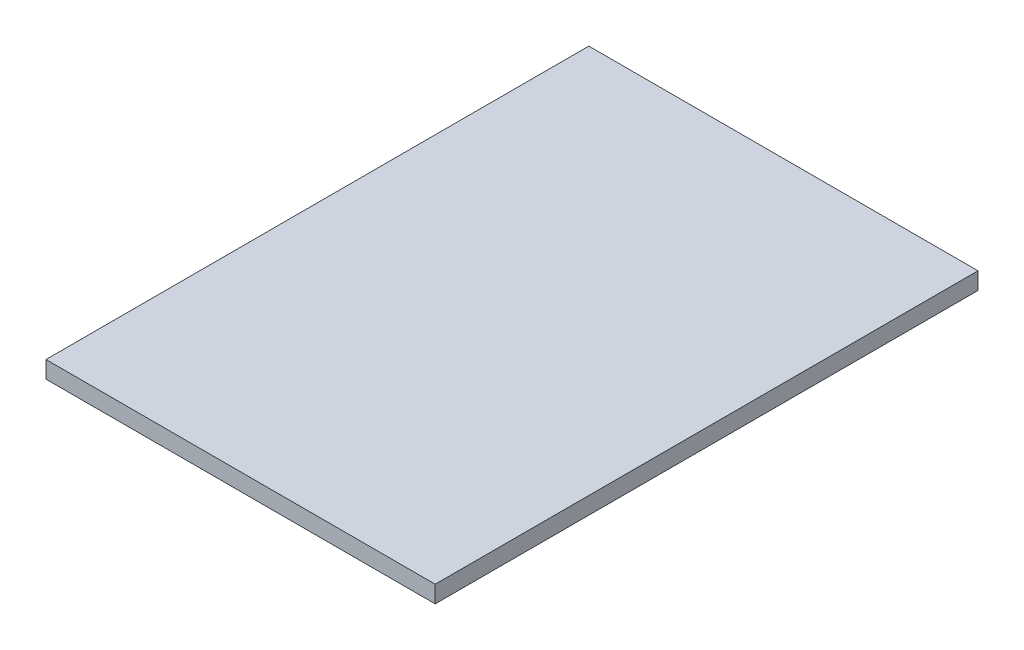
ISO-10303-21;
HEADER;
FILE_DESCRIPTION(('STEP AP214'),'2;1');
FILE_NAME('part.step','',(''),(''),'','','');
FILE_SCHEMA(('AUTOMOTIVE_DESIGN { 1 0 10303 214 1 1 1 1 }'));
ENDSEC;
DATA;
#1=APPLICATION_CONTEXT('core data for automotive mechanical design processes');
#2=APPLICATION_PROTOCOL_DEFINITION('international standard','automotive_design',2000,#1);
#3=PRODUCT_CONTEXT('',#1,'mechanical');
#4=PRODUCT('Part','Part','',(#3));
#5=PRODUCT_RELATED_PRODUCT_CATEGORY('part','',(#4));
#6=PRODUCT_DEFINITION_FORMATION('','',#4);
#7=PRODUCT_DEFINITION_CONTEXT('part definition',#1,'design');
#8=PRODUCT_DEFINITION('design','',#6,#7);
#9=PRODUCT_DEFINITION_SHAPE('','',#8);
#10=(LENGTH_UNIT() NAMED_UNIT(*) SI_UNIT(.MILLI.,.METRE.));
#11=(NAMED_UNIT(*) PLANE_ANGLE_UNIT() SI_UNIT($,.RADIAN.));
#12=(NAMED_UNIT(*) SI_UNIT($,.STERADIAN.) SOLID_ANGLE_UNIT());
#13=UNCERTAINTY_MEASURE_WITH_UNIT(LENGTH_MEASURE(1.E-05),#10,'distance_accuracy_value','');
#14=(GEOMETRIC_REPRESENTATION_CONTEXT(3) GLOBAL_UNCERTAINTY_ASSIGNED_CONTEXT((#13)) GLOBAL_UNIT_ASSIGNED_CONTEXT((#10,
#11,#12)) REPRESENTATION_CONTEXT('',''));
#15=CARTESIAN_POINT('',(0.,0.,0.));
#16=DIRECTION('',(0.,0.,1.));
#17=DIRECTION('',(1.,0.,0.));
#18=AXIS2_PLACEMENT_3D('',#15,#16,#17);
#19=CARTESIAN_POINT('',(28.956,2.54,40.386));
#20=DIRECTION('',(-1.,0.,0.));
#21=DIRECTION('',(0.,0.,1.));
#22=AXIS2_PLACEMENT_3D('',#19,#20,#21);
#23=PLANE('',#22);
#24=DIRECTION('',(0.,0.,-1.));
#25=VECTOR('',#24,1.);
#26=CARTESIAN_POINT('',(28.956,0.,40.386));
#27=LINE('',#26,#25);
#28=CARTESIAN_POINT('',(28.956,0.,40.386));
#29=VERTEX_POINT('',#28);
#30=CARTESIAN_POINT('',(28.956,0.,-40.386));
#31=VERTEX_POINT('',#30);
#32=EDGE_CURVE('E102',#29,#31,#27,.T.);
#33=ORIENTED_EDGE('',*,*,#32,.T.);
#34=DIRECTION('',(0.,-1.,0.));
#35=VECTOR('',#34,1.);
#36=CARTESIAN_POINT('',(28.956,2.54,-40.386));
#37=LINE('',#36,#35);
#38=CARTESIAN_POINT('',(28.956,2.54,-40.386));
#39=VERTEX_POINT('',#38);
#40=EDGE_CURVE('E11',#39,#31,#37,.T.);
#41=ORIENTED_EDGE('',*,*,#40,.F.);
#42=DIRECTION('',(0.,0.,-1.));
#43=VECTOR('',#42,1.);
#44=CARTESIAN_POINT('',(28.956,2.54,40.386));
#45=LINE('',#44,#43);
#46=CARTESIAN_POINT('',(28.956,2.54,40.386));
#47=VERTEX_POINT('',#46);
#48=EDGE_CURVE('E90',#47,#39,#45,.T.);
#49=ORIENTED_EDGE('',*,*,#48,.F.);
#50=DIRECTION('',(0.,-1.,0.));
#51=VECTOR('',#50,1.);
#52=CARTESIAN_POINT('',(28.956,2.54,40.386));
#53=LINE('',#52,#51);
#54=EDGE_CURVE('E98',#47,#29,#53,.T.);
#55=ORIENTED_EDGE('',*,*,#54,.T.);
#56=EDGE_LOOP('',(#33,#41,#49,#55));
#57=FACE_BOUND('',#56,.T.);
#58=ADVANCED_FACE('F39',(#57),#23,.F.);
#59=CARTESIAN_POINT('',(-28.956,2.54,-40.386));
#60=DIRECTION('',(0.,0.,1.));
#61=DIRECTION('',(1.,0.,0.));
#62=AXIS2_PLACEMENT_3D('',#59,#60,#61);
#63=PLANE('',#62);
#64=DIRECTION('',(-1.,0.,0.));
#65=VECTOR('',#64,1.);
#66=CARTESIAN_POINT('',(-28.956,0.,-40.386));
#67=LINE('',#66,#65);
#68=CARTESIAN_POINT('',(-28.956,0.,-40.386));
#69=VERTEX_POINT('',#68);
#70=EDGE_CURVE('E94',#31,#69,#67,.T.);
#71=ORIENTED_EDGE('',*,*,#70,.T.);
#72=DIRECTION('',(0.,-1.,0.));
#73=VECTOR('',#72,1.);
#74=CARTESIAN_POINT('',(-28.956,2.54,-40.386));
#75=LINE('',#74,#73);
#76=CARTESIAN_POINT('',(-28.956,2.54,-40.386));
#77=VERTEX_POINT('',#76);
#78=EDGE_CURVE('E47',#77,#69,#75,.T.);
#79=ORIENTED_EDGE('',*,*,#78,.F.);
#80=DIRECTION('',(-1.,0.,0.));
#81=VECTOR('',#80,1.);
#82=CARTESIAN_POINT('',(-28.956,2.54,-40.386));
#83=LINE('',#82,#81);
#84=EDGE_CURVE('E85',#39,#77,#83,.T.);
#85=ORIENTED_EDGE('',*,*,#84,.F.);
#86=ORIENTED_EDGE('',*,*,#40,.T.);
#87=EDGE_LOOP('',(#71,#79,#85,#86));
#88=FACE_BOUND('',#87,.T.);
#89=ADVANCED_FACE('F93',(#88),#63,.F.);
#90=CARTESIAN_POINT('',(-28.956,2.54,40.386));
#91=DIRECTION('',(1.,0.,0.));
#92=DIRECTION('',(0.,0.,-1.));
#93=AXIS2_PLACEMENT_3D('',#90,#91,#92);
#94=PLANE('',#93);
#95=DIRECTION('',(0.,0.,1.));
#96=VECTOR('',#95,1.);
#97=CARTESIAN_POINT('',(-28.956,0.,40.386));
#98=LINE('',#97,#96);
#99=CARTESIAN_POINT('',(-28.956,0.,40.386));
#100=VERTEX_POINT('',#99);
#101=EDGE_CURVE('E72',#69,#100,#98,.T.);
#102=ORIENTED_EDGE('',*,*,#101,.T.);
#103=DIRECTION('',(0.,-1.,0.));
#104=VECTOR('',#103,1.);
#105=CARTESIAN_POINT('',(-28.956,2.54,40.386));
#106=LINE('',#105,#104);
#107=CARTESIAN_POINT('',(-28.956,2.54,40.386));
#108=VERTEX_POINT('',#107);
#109=EDGE_CURVE('E95',#108,#100,#106,.T.);
#110=ORIENTED_EDGE('',*,*,#109,.F.);
#111=DIRECTION('',(0.,0.,1.));
#112=VECTOR('',#111,1.);
#113=CARTESIAN_POINT('',(-28.956,2.54,40.386));
#114=LINE('',#113,#112);
#115=EDGE_CURVE('E88',#77,#108,#114,.T.);
#116=ORIENTED_EDGE('',*,*,#115,.F.);
#117=ORIENTED_EDGE('',*,*,#78,.T.);
#118=EDGE_LOOP('',(#102,#110,#116,#117));
#119=FACE_BOUND('',#118,.T.);
#120=ADVANCED_FACE('F96',(#119),#94,.F.);
#121=CARTESIAN_POINT('',(-28.956,2.54,40.386));
#122=DIRECTION('',(0.,0.,-1.));
#123=DIRECTION('',(-1.,0.,0.));
#124=AXIS2_PLACEMENT_3D('',#121,#122,#123);
#125=PLANE('',#124);
#126=DIRECTION('',(1.,0.,0.));
#127=VECTOR('',#126,1.);
#128=CARTESIAN_POINT('',(-28.956,0.,40.386));
#129=LINE('',#128,#127);
#130=EDGE_CURVE('E78',#100,#29,#129,.T.);
#131=ORIENTED_EDGE('',*,*,#130,.T.);
#132=ORIENTED_EDGE('',*,*,#54,.F.);
#133=DIRECTION('',(1.,0.,0.));
#134=VECTOR('',#133,1.);
#135=CARTESIAN_POINT('',(-28.956,2.54,40.386));
#136=LINE('',#135,#134);
#137=EDGE_CURVE('E55',#108,#47,#136,.T.);
#138=ORIENTED_EDGE('',*,*,#137,.F.);
#139=ORIENTED_EDGE('',*,*,#109,.T.);
#140=EDGE_LOOP('',(#131,#132,#138,#139));
#141=FACE_BOUND('',#140,.T.);
#142=ADVANCED_FACE('F109',(#141),#125,.F.);
#143=CARTESIAN_POINT('',(0.,2.54,0.));
#144=DIRECTION('',(0.,-1.,0.));
#145=DIRECTION('',(0.,0.,-1.));
#146=AXIS2_PLACEMENT_3D('',#143,#144,#145);
#147=PLANE('',#146);
#148=ORIENTED_EDGE('',*,*,#48,.T.);
#149=ORIENTED_EDGE('',*,*,#84,.T.);
#150=ORIENTED_EDGE('',*,*,#115,.T.);
#151=ORIENTED_EDGE('',*,*,#137,.T.);
#152=EDGE_LOOP('',(#148,#149,#150,#151));
#153=FACE_BOUND('',#152,.T.);
#154=ADVANCED_FACE('F86',(#153),#147,.F.);
#155=CARTESIAN_POINT('',(0.,0.,0.));
#156=DIRECTION('',(0.,-1.,0.));
#157=DIRECTION('',(0.,0.,-1.));
#158=AXIS2_PLACEMENT_3D('',#155,#156,#157);
#159=PLANE('',#158);
#160=ORIENTED_EDGE('',*,*,#32,.F.);
#161=ORIENTED_EDGE('',*,*,#130,.F.);
#162=ORIENTED_EDGE('',*,*,#101,.F.);
#163=ORIENTED_EDGE('',*,*,#70,.F.);
#164=EDGE_LOOP('',(#160,#161,#162,#163));
#165=FACE_BOUND('',#164,.T.);
#166=ADVANCED_FACE('F112',(#165),#159,.T.);
#167=CLOSED_SHELL('',(#58,#89,#120,#142,#154,#166));
#168=MANIFOLD_SOLID_BREP('B2',#167);
#169=ADVANCED_BREP_SHAPE_REPRESENTATION('',(#18,#168),#14);
#170=SHAPE_DEFINITION_REPRESENTATION(#9,#169);
ENDSEC;
END-ISO-10303-21;
